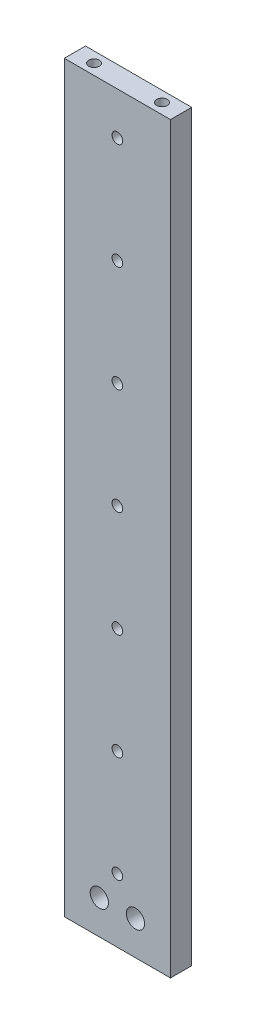
ISO-10303-21;
HEADER;
FILE_DESCRIPTION(('STEP AP214'),'2;1');
FILE_NAME('part.step','',(''),(''),'','','');
FILE_SCHEMA(('AUTOMOTIVE_DESIGN { 1 0 10303 214 1 1 1 1 }'));
ENDSEC;
DATA;
#1=APPLICATION_CONTEXT('core data for automotive mechanical design processes');
#2=APPLICATION_PROTOCOL_DEFINITION('international standard','automotive_design',2000,#1);
#3=PRODUCT_CONTEXT('',#1,'mechanical');
#4=PRODUCT('Part','Part','',(#3));
#5=PRODUCT_RELATED_PRODUCT_CATEGORY('part','',(#4));
#6=PRODUCT_DEFINITION_FORMATION('','',#4);
#7=PRODUCT_DEFINITION_CONTEXT('part definition',#1,'design');
#8=PRODUCT_DEFINITION('design','',#6,#7);
#9=PRODUCT_DEFINITION_SHAPE('','',#8);
#10=(LENGTH_UNIT() NAMED_UNIT(*) SI_UNIT(.MILLI.,.METRE.));
#11=(NAMED_UNIT(*) PLANE_ANGLE_UNIT() SI_UNIT($,.RADIAN.));
#12=(NAMED_UNIT(*) SI_UNIT($,.STERADIAN.) SOLID_ANGLE_UNIT());
#13=UNCERTAINTY_MEASURE_WITH_UNIT(LENGTH_MEASURE(1.E-05),#10,'distance_accuracy_value','');
#14=(GEOMETRIC_REPRESENTATION_CONTEXT(3) GLOBAL_UNCERTAINTY_ASSIGNED_CONTEXT((#13)) GLOBAL_UNIT_ASSIGNED_CONTEXT((#10,
#11,#12)) REPRESENTATION_CONTEXT('',''));
#15=CARTESIAN_POINT('',(0.,0.,0.));
#16=DIRECTION('',(0.,0.,1.));
#17=DIRECTION('',(1.,0.,0.));
#18=AXIS2_PLACEMENT_3D('',#15,#16,#17);
#19=CARTESIAN_POINT('',(-12.5,175.,0.));
#20=DIRECTION('',(0.,0.,1.));
#21=DIRECTION('',(0.,-1.,0.));
#22=AXIS2_PLACEMENT_3D('',#19,#20,#21);
#23=PLANE('',#22);
#24=CARTESIAN_POINT('',(4.25,8.,0.));
#25=DIRECTION('',(0.,0.,1.));
#26=DIRECTION('',(0.,-1.,0.));
#27=AXIS2_PLACEMENT_3D('',#24,#25,#26);
#28=CIRCLE('',#27,2.15);
#29=CARTESIAN_POINT('',(4.25,5.85,0.));
#30=VERTEX_POINT('',#29);
#31=EDGE_CURVE('E219',#30,#30,#28,.T.);
#32=ORIENTED_EDGE('',*,*,#31,.F.);
#33=EDGE_LOOP('',(#32));
#34=FACE_BOUND('',#33,.T.);
#35=CARTESIAN_POINT('',(-4.25,8.,0.));
#36=DIRECTION('',(0.,0.,1.));
#37=DIRECTION('',(0.,-1.,0.));
#38=AXIS2_PLACEMENT_3D('',#35,#36,#37);
#39=CIRCLE('',#38,2.15);
#40=CARTESIAN_POINT('',(-4.25,5.85,0.));
#41=VERTEX_POINT('',#40);
#42=EDGE_CURVE('E104',#41,#41,#39,.T.);
#43=ORIENTED_EDGE('',*,*,#42,.F.);
#44=EDGE_LOOP('',(#43));
#45=FACE_BOUND('',#44,.T.);
#46=CARTESIAN_POINT('',(0.,165.,0.));
#47=DIRECTION('',(0.,0.,-1.));
#48=DIRECTION('',(0.,1.,0.));
#49=AXIS2_PLACEMENT_3D('',#46,#47,#48);
#50=CIRCLE('',#49,1.25);
#51=CARTESIAN_POINT('',(0.,166.25,0.));
#52=VERTEX_POINT('',#51);
#53=EDGE_CURVE('E125',#52,#52,#50,.T.);
#54=ORIENTED_EDGE('',*,*,#53,.T.);
#55=EDGE_LOOP('',(#54));
#56=FACE_BOUND('',#55,.T.);
#57=CARTESIAN_POINT('',(0.,140.,0.));
#58=DIRECTION('',(0.,0.,-1.));
#59=DIRECTION('',(0.,1.,0.));
#60=AXIS2_PLACEMENT_3D('',#57,#58,#59);
#61=CIRCLE('',#60,1.25);
#62=CARTESIAN_POINT('',(0.,141.25,0.));
#63=VERTEX_POINT('',#62);
#64=EDGE_CURVE('E131',#63,#63,#61,.T.);
#65=ORIENTED_EDGE('',*,*,#64,.T.);
#66=EDGE_LOOP('',(#65));
#67=FACE_BOUND('',#66,.T.);
#68=CARTESIAN_POINT('',(0.,115.,0.));
#69=DIRECTION('',(0.,0.,-1.));
#70=DIRECTION('',(0.,1.,0.));
#71=AXIS2_PLACEMENT_3D('',#68,#69,#70);
#72=CIRCLE('',#71,1.25);
#73=CARTESIAN_POINT('',(0.,116.25,0.));
#74=VERTEX_POINT('',#73);
#75=EDGE_CURVE('E137',#74,#74,#72,.T.);
#76=ORIENTED_EDGE('',*,*,#75,.T.);
#77=EDGE_LOOP('',(#76));
#78=FACE_BOUND('',#77,.T.);
#79=CARTESIAN_POINT('',(0.,90.,0.));
#80=DIRECTION('',(0.,0.,-1.));
#81=DIRECTION('',(0.,1.,0.));
#82=AXIS2_PLACEMENT_3D('',#79,#80,#81);
#83=CIRCLE('',#82,1.25);
#84=CARTESIAN_POINT('',(0.,91.25,0.));
#85=VERTEX_POINT('',#84);
#86=EDGE_CURVE('E143',#85,#85,#83,.T.);
#87=ORIENTED_EDGE('',*,*,#86,.T.);
#88=EDGE_LOOP('',(#87));
#89=FACE_BOUND('',#88,.T.);
#90=CARTESIAN_POINT('',(0.,65.,0.));
#91=DIRECTION('',(0.,0.,-1.));
#92=DIRECTION('',(0.,1.,0.));
#93=AXIS2_PLACEMENT_3D('',#90,#91,#92);
#94=CIRCLE('',#93,1.25);
#95=CARTESIAN_POINT('',(0.,66.25,0.));
#96=VERTEX_POINT('',#95);
#97=EDGE_CURVE('E149',#96,#96,#94,.T.);
#98=ORIENTED_EDGE('',*,*,#97,.T.);
#99=EDGE_LOOP('',(#98));
#100=FACE_BOUND('',#99,.T.);
#101=CARTESIAN_POINT('',(0.,40.,0.));
#102=DIRECTION('',(0.,0.,-1.));
#103=DIRECTION('',(0.,1.,0.));
#104=AXIS2_PLACEMENT_3D('',#101,#102,#103);
#105=CIRCLE('',#104,1.25);
#106=CARTESIAN_POINT('',(0.,41.25,0.));
#107=VERTEX_POINT('',#106);
#108=EDGE_CURVE('E155',#107,#107,#105,.T.);
#109=ORIENTED_EDGE('',*,*,#108,.T.);
#110=EDGE_LOOP('',(#109));
#111=FACE_BOUND('',#110,.T.);
#112=CARTESIAN_POINT('',(0.,15.,0.));
#113=DIRECTION('',(0.,0.,-1.));
#114=DIRECTION('',(0.,1.,0.));
#115=AXIS2_PLACEMENT_3D('',#112,#113,#114);
#116=CIRCLE('',#115,1.25);
#117=CARTESIAN_POINT('',(0.,16.25,0.));
#118=VERTEX_POINT('',#117);
#119=EDGE_CURVE('E161',#118,#118,#116,.T.);
#120=ORIENTED_EDGE('',*,*,#119,.T.);
#121=EDGE_LOOP('',(#120));
#122=FACE_BOUND('',#121,.T.);
#123=DIRECTION('',(1.,0.,0.));
#124=VECTOR('',#123,1.);
#125=CARTESIAN_POINT('',(-12.5,0.,0.));
#126=LINE('',#125,#124);
#127=CARTESIAN_POINT('',(-12.5,0.,0.));
#128=VERTEX_POINT('',#127);
#129=CARTESIAN_POINT('',(12.5,0.,0.));
#130=VERTEX_POINT('',#129);
#131=EDGE_CURVE('E39',#128,#130,#126,.T.);
#132=ORIENTED_EDGE('',*,*,#131,.T.);
#133=DIRECTION('',(0.,-1.,0.));
#134=VECTOR('',#133,1.);
#135=CARTESIAN_POINT('',(12.5,175.,0.));
#136=LINE('',#135,#134);
#137=CARTESIAN_POINT('',(12.5,175.,0.));
#138=VERTEX_POINT('',#137);
#139=EDGE_CURVE('E164',#138,#130,#136,.T.);
#140=ORIENTED_EDGE('',*,*,#139,.F.);
#141=DIRECTION('',(1.,0.,0.));
#142=VECTOR('',#141,1.);
#143=CARTESIAN_POINT('',(-12.5,175.,0.));
#144=LINE('',#143,#142);
#145=CARTESIAN_POINT('',(-12.5,175.,0.));
#146=VERTEX_POINT('',#145);
#147=EDGE_CURVE('E11',#146,#138,#144,.T.);
#148=ORIENTED_EDGE('',*,*,#147,.F.);
#149=DIRECTION('',(0.,-1.,0.));
#150=VECTOR('',#149,1.);
#151=CARTESIAN_POINT('',(-12.5,175.,0.));
#152=LINE('',#151,#150);
#153=EDGE_CURVE('E176',#146,#128,#152,.T.);
#154=ORIENTED_EDGE('',*,*,#153,.T.);
#155=EDGE_LOOP('',(#132,#140,#148,#154));
#156=FACE_BOUND('',#155,.T.);
#157=ADVANCED_FACE('F36',(#34,#45,#56,#67,#78,#89,#100,#111,#122,#156),#23,.T.);
#158=CARTESIAN_POINT('',(-12.5,175.,-5.));
#159=DIRECTION('',(0.,1.,0.));
#160=DIRECTION('',(0.,0.,1.));
#161=AXIS2_PLACEMENT_3D('',#158,#159,#160);
#162=PLANE('',#161);
#163=CARTESIAN_POINT('',(-8.,175.,-2.5));
#164=DIRECTION('',(0.,1.,0.));
#165=DIRECTION('',(0.,0.,1.));
#166=AXIS2_PLACEMENT_3D('',#163,#164,#165);
#167=CIRCLE('',#166,1.25);
#168=CARTESIAN_POINT('',(-8.,175.,-1.25));
#169=VERTEX_POINT('',#168);
#170=EDGE_CURVE('E110',#169,#169,#167,.T.);
#171=ORIENTED_EDGE('',*,*,#170,.F.);
#172=EDGE_LOOP('',(#171));
#173=FACE_BOUND('',#172,.T.);
#174=CARTESIAN_POINT('',(8.,175.,-2.5));
#175=DIRECTION('',(0.,1.,0.));
#176=DIRECTION('',(0.,0.,1.));
#177=AXIS2_PLACEMENT_3D('',#174,#175,#176);
#178=CIRCLE('',#177,1.25);
#179=CARTESIAN_POINT('',(8.,175.,-1.25));
#180=VERTEX_POINT('',#179);
#181=EDGE_CURVE('E116',#180,#180,#178,.T.);
#182=ORIENTED_EDGE('',*,*,#181,.F.);
#183=EDGE_LOOP('',(#182));
#184=FACE_BOUND('',#183,.T.);
#185=ORIENTED_EDGE('',*,*,#147,.T.);
#186=DIRECTION('',(0.,0.,1.));
#187=VECTOR('',#186,1.);
#188=CARTESIAN_POINT('',(12.5,175.,-5.));
#189=LINE('',#188,#187);
#190=CARTESIAN_POINT('',(12.5,175.,-5.));
#191=VERTEX_POINT('',#190);
#192=EDGE_CURVE('E173',#191,#138,#189,.T.);
#193=ORIENTED_EDGE('',*,*,#192,.F.);
#194=DIRECTION('',(1.,0.,0.));
#195=VECTOR('',#194,1.);
#196=CARTESIAN_POINT('',(-12.5,175.,-5.));
#197=LINE('',#196,#195);
#198=CARTESIAN_POINT('',(-12.5,175.,-5.));
#199=VERTEX_POINT('',#198);
#200=EDGE_CURVE('E44',#199,#191,#197,.T.);
#201=ORIENTED_EDGE('',*,*,#200,.F.);
#202=DIRECTION('',(0.,0.,1.));
#203=VECTOR('',#202,1.);
#204=CARTESIAN_POINT('',(-12.5,175.,-5.));
#205=LINE('',#204,#203);
#206=EDGE_CURVE('E183',#199,#146,#205,.T.);
#207=ORIENTED_EDGE('',*,*,#206,.T.);
#208=EDGE_LOOP('',(#185,#193,#201,#207));
#209=FACE_BOUND('',#208,.T.);
#210=ADVANCED_FACE('F193',(#173,#184,#209),#162,.T.);
#211=CARTESIAN_POINT('',(-12.5,0.,-5.));
#212=DIRECTION('',(0.,0.,-1.));
#213=DIRECTION('',(-1.,0.,0.));
#214=AXIS2_PLACEMENT_3D('',#211,#212,#213);
#215=PLANE('',#214);
#216=CARTESIAN_POINT('',(4.25,8.,-5.));
#217=DIRECTION('',(0.,0.,-1.));
#218=DIRECTION('',(-1.,0.,0.));
#219=AXIS2_PLACEMENT_3D('',#216,#217,#218);
#220=CIRCLE('',#219,2.15);
#221=CARTESIAN_POINT('',(2.1,8.,-5.));
#222=VERTEX_POINT('',#221);
#223=EDGE_CURVE('E447',#222,#222,#220,.T.);
#224=ORIENTED_EDGE('',*,*,#223,.F.);
#225=EDGE_LOOP('',(#224));
#226=FACE_BOUND('',#225,.T.);
#227=CARTESIAN_POINT('',(-4.25,8.,-5.));
#228=DIRECTION('',(0.,0.,-1.));
#229=DIRECTION('',(-1.,0.,0.));
#230=AXIS2_PLACEMENT_3D('',#227,#228,#229);
#231=CIRCLE('',#230,2.15);
#232=CARTESIAN_POINT('',(-6.4,8.,-5.));
#233=VERTEX_POINT('',#232);
#234=EDGE_CURVE('E448',#233,#233,#231,.T.);
#235=ORIENTED_EDGE('',*,*,#234,.F.);
#236=EDGE_LOOP('',(#235));
#237=FACE_BOUND('',#236,.T.);
#238=CARTESIAN_POINT('',(0.,165.,-4.99999999999999));
#239=DIRECTION('',(0.,0.,-1.));
#240=DIRECTION('',(0.,1.,0.));
#241=AXIS2_PLACEMENT_3D('',#238,#239,#240);
#242=CIRCLE('',#241,1.25);
#243=CARTESIAN_POINT('',(0.,166.25,-4.99999999999999));
#244=VERTEX_POINT('',#243);
#245=EDGE_CURVE('E122',#244,#244,#242,.T.);
#246=ORIENTED_EDGE('',*,*,#245,.F.);
#247=EDGE_LOOP('',(#246));
#248=FACE_BOUND('',#247,.T.);
#249=CARTESIAN_POINT('',(0.,140.,-4.99999999999999));
#250=DIRECTION('',(0.,0.,-1.));
#251=DIRECTION('',(0.,1.,0.));
#252=AXIS2_PLACEMENT_3D('',#249,#250,#251);
#253=CIRCLE('',#252,1.25);
#254=CARTESIAN_POINT('',(0.,141.25,-4.99999999999999));
#255=VERTEX_POINT('',#254);
#256=EDGE_CURVE('E128',#255,#255,#253,.T.);
#257=ORIENTED_EDGE('',*,*,#256,.F.);
#258=EDGE_LOOP('',(#257));
#259=FACE_BOUND('',#258,.T.);
#260=CARTESIAN_POINT('',(0.,115.,-5.));
#261=DIRECTION('',(0.,0.,-1.));
#262=DIRECTION('',(0.,1.,0.));
#263=AXIS2_PLACEMENT_3D('',#260,#261,#262);
#264=CIRCLE('',#263,1.25);
#265=CARTESIAN_POINT('',(0.,116.25,-5.));
#266=VERTEX_POINT('',#265);
#267=EDGE_CURVE('E134',#266,#266,#264,.T.);
#268=ORIENTED_EDGE('',*,*,#267,.F.);
#269=EDGE_LOOP('',(#268));
#270=FACE_BOUND('',#269,.T.);
#271=CARTESIAN_POINT('',(0.,90.,-5.));
#272=DIRECTION('',(0.,0.,-1.));
#273=DIRECTION('',(0.,1.,0.));
#274=AXIS2_PLACEMENT_3D('',#271,#272,#273);
#275=CIRCLE('',#274,1.25);
#276=CARTESIAN_POINT('',(0.,91.25,-5.));
#277=VERTEX_POINT('',#276);
#278=EDGE_CURVE('E140',#277,#277,#275,.T.);
#279=ORIENTED_EDGE('',*,*,#278,.F.);
#280=EDGE_LOOP('',(#279));
#281=FACE_BOUND('',#280,.T.);
#282=CARTESIAN_POINT('',(0.,65.,-5.));
#283=DIRECTION('',(0.,0.,-1.));
#284=DIRECTION('',(0.,1.,0.));
#285=AXIS2_PLACEMENT_3D('',#282,#283,#284);
#286=CIRCLE('',#285,1.25);
#287=CARTESIAN_POINT('',(0.,66.25,-5.));
#288=VERTEX_POINT('',#287);
#289=EDGE_CURVE('E146',#288,#288,#286,.T.);
#290=ORIENTED_EDGE('',*,*,#289,.F.);
#291=EDGE_LOOP('',(#290));
#292=FACE_BOUND('',#291,.T.);
#293=CARTESIAN_POINT('',(0.,40.,-5.));
#294=DIRECTION('',(0.,0.,-1.));
#295=DIRECTION('',(0.,1.,0.));
#296=AXIS2_PLACEMENT_3D('',#293,#294,#295);
#297=CIRCLE('',#296,1.25);
#298=CARTESIAN_POINT('',(0.,41.25,-5.));
#299=VERTEX_POINT('',#298);
#300=EDGE_CURVE('E152',#299,#299,#297,.T.);
#301=ORIENTED_EDGE('',*,*,#300,.F.);
#302=EDGE_LOOP('',(#301));
#303=FACE_BOUND('',#302,.T.);
#304=CARTESIAN_POINT('',(0.,15.,-5.));
#305=DIRECTION('',(0.,0.,-1.));
#306=DIRECTION('',(0.,1.,0.));
#307=AXIS2_PLACEMENT_3D('',#304,#305,#306);
#308=CIRCLE('',#307,1.25);
#309=CARTESIAN_POINT('',(0.,16.25,-5.));
#310=VERTEX_POINT('',#309);
#311=EDGE_CURVE('E158',#310,#310,#308,.T.);
#312=ORIENTED_EDGE('',*,*,#311,.F.);
#313=EDGE_LOOP('',(#312));
#314=FACE_BOUND('',#313,.T.);
#315=ORIENTED_EDGE('',*,*,#200,.T.);
#316=DIRECTION('',(0.,1.,0.));
#317=VECTOR('',#316,1.);
#318=CARTESIAN_POINT('',(12.5,0.,-5.));
#319=LINE('',#318,#317);
#320=CARTESIAN_POINT('',(12.5,0.,-5.));
#321=VERTEX_POINT('',#320);
#322=EDGE_CURVE('E170',#321,#191,#319,.T.);
#323=ORIENTED_EDGE('',*,*,#322,.F.);
#324=DIRECTION('',(1.,0.,0.));
#325=VECTOR('',#324,1.);
#326=CARTESIAN_POINT('',(-12.5,0.,-5.));
#327=LINE('',#326,#325);
#328=CARTESIAN_POINT('',(-12.5,0.,-5.));
#329=VERTEX_POINT('',#328);
#330=EDGE_CURVE('E185',#329,#321,#327,.T.);
#331=ORIENTED_EDGE('',*,*,#330,.F.);
#332=DIRECTION('',(0.,1.,0.));
#333=VECTOR('',#332,1.);
#334=CARTESIAN_POINT('',(-12.5,0.,-5.));
#335=LINE('',#334,#333);
#336=EDGE_CURVE('E181',#329,#199,#335,.T.);
#337=ORIENTED_EDGE('',*,*,#336,.T.);
#338=EDGE_LOOP('',(#315,#323,#331,#337));
#339=FACE_BOUND('',#338,.T.);
#340=ADVANCED_FACE('F199',(#226,#237,#248,#259,#270,#281,#292,#303,#314,#339),#215,.T.);
#341=CARTESIAN_POINT('',(-12.5,0.,0.));
#342=DIRECTION('',(0.,-1.,0.));
#343=DIRECTION('',(0.,0.,-1.));
#344=AXIS2_PLACEMENT_3D('',#341,#342,#343);
#345=PLANE('',#344);
#346=CARTESIAN_POINT('',(-8.,0.,-2.5));
#347=DIRECTION('',(0.,-1.,0.));
#348=DIRECTION('',(0.,0.,-1.));
#349=AXIS2_PLACEMENT_3D('',#346,#347,#348);
#350=CIRCLE('',#349,1.25);
#351=CARTESIAN_POINT('',(-8.,0.,-3.75));
#352=VERTEX_POINT('',#351);
#353=EDGE_CURVE('E98',#352,#352,#350,.T.);
#354=ORIENTED_EDGE('',*,*,#353,.F.);
#355=EDGE_LOOP('',(#354));
#356=FACE_BOUND('',#355,.T.);
#357=CARTESIAN_POINT('',(8.,0.,-2.5));
#358=DIRECTION('',(0.,-1.,0.));
#359=DIRECTION('',(0.,0.,-1.));
#360=AXIS2_PLACEMENT_3D('',#357,#358,#359);
#361=CIRCLE('',#360,1.25);
#362=CARTESIAN_POINT('',(8.,0.,-3.75));
#363=VERTEX_POINT('',#362);
#364=EDGE_CURVE('E97',#363,#363,#361,.T.);
#365=ORIENTED_EDGE('',*,*,#364,.F.);
#366=EDGE_LOOP('',(#365));
#367=FACE_BOUND('',#366,.T.);
#368=ORIENTED_EDGE('',*,*,#330,.T.);
#369=DIRECTION('',(0.,0.,-1.));
#370=VECTOR('',#369,1.);
#371=CARTESIAN_POINT('',(12.5,0.,0.));
#372=LINE('',#371,#370);
#373=EDGE_CURVE('E167',#130,#321,#372,.T.);
#374=ORIENTED_EDGE('',*,*,#373,.F.);
#375=ORIENTED_EDGE('',*,*,#131,.F.);
#376=DIRECTION('',(0.,0.,-1.));
#377=VECTOR('',#376,1.);
#378=CARTESIAN_POINT('',(-12.5,0.,0.));
#379=LINE('',#378,#377);
#380=EDGE_CURVE('E178',#128,#329,#379,.T.);
#381=ORIENTED_EDGE('',*,*,#380,.T.);
#382=EDGE_LOOP('',(#368,#374,#375,#381));
#383=FACE_BOUND('',#382,.T.);
#384=ADVANCED_FACE('F189',(#356,#367,#383),#345,.T.);
#385=CARTESIAN_POINT('',(-12.5,0.,0.));
#386=DIRECTION('',(1.,0.,0.));
#387=DIRECTION('',(0.,0.,-1.));
#388=AXIS2_PLACEMENT_3D('',#385,#386,#387);
#389=PLANE('',#388);
#390=ORIENTED_EDGE('',*,*,#153,.F.);
#391=ORIENTED_EDGE('',*,*,#206,.F.);
#392=ORIENTED_EDGE('',*,*,#336,.F.);
#393=ORIENTED_EDGE('',*,*,#380,.F.);
#394=EDGE_LOOP('',(#390,#391,#392,#393));
#395=FACE_BOUND('',#394,.T.);
#396=ADVANCED_FACE('F197',(#395),#389,.F.);
#397=CARTESIAN_POINT('',(12.5,0.,0.));
#398=DIRECTION('',(1.,0.,0.));
#399=DIRECTION('',(0.,0.,-1.));
#400=AXIS2_PLACEMENT_3D('',#397,#398,#399);
#401=PLANE('',#400);
#402=ORIENTED_EDGE('',*,*,#139,.T.);
#403=ORIENTED_EDGE('',*,*,#373,.T.);
#404=ORIENTED_EDGE('',*,*,#322,.T.);
#405=ORIENTED_EDGE('',*,*,#192,.T.);
#406=EDGE_LOOP('',(#402,#403,#404,#405));
#407=FACE_BOUND('',#406,.T.);
#408=ADVANCED_FACE('F192',(#407),#401,.T.);
#409=CARTESIAN_POINT('',(0.,15.,-5.));
#410=DIRECTION('',(0.,0.,-1.));
#411=DIRECTION('',(0.,1.,0.));
#412=AXIS2_PLACEMENT_3D('',#409,#410,#411);
#413=CYLINDRICAL_SURFACE('',#412,1.25);
#414=ORIENTED_EDGE('',*,*,#119,.F.);
#415=EDGE_LOOP('',(#414));
#416=FACE_BOUND('',#415,.T.);
#417=ORIENTED_EDGE('',*,*,#311,.T.);
#418=EDGE_LOOP('',(#417));
#419=FACE_BOUND('',#418,.T.);
#420=ADVANCED_FACE('F237',(#416,#419),#413,.F.);
#421=CARTESIAN_POINT('',(0.,40.,-5.));
#422=DIRECTION('',(0.,0.,-1.));
#423=DIRECTION('',(0.,1.,0.));
#424=AXIS2_PLACEMENT_3D('',#421,#422,#423);
#425=CYLINDRICAL_SURFACE('',#424,1.25);
#426=ORIENTED_EDGE('',*,*,#108,.F.);
#427=EDGE_LOOP('',(#426));
#428=FACE_BOUND('',#427,.T.);
#429=ORIENTED_EDGE('',*,*,#300,.T.);
#430=EDGE_LOOP('',(#429));
#431=FACE_BOUND('',#430,.T.);
#432=ADVANCED_FACE('F240',(#428,#431),#425,.F.);
#433=CARTESIAN_POINT('',(0.,65.,-5.));
#434=DIRECTION('',(0.,0.,-1.));
#435=DIRECTION('',(0.,1.,0.));
#436=AXIS2_PLACEMENT_3D('',#433,#434,#435);
#437=CYLINDRICAL_SURFACE('',#436,1.25);
#438=ORIENTED_EDGE('',*,*,#97,.F.);
#439=EDGE_LOOP('',(#438));
#440=FACE_BOUND('',#439,.T.);
#441=ORIENTED_EDGE('',*,*,#289,.T.);
#442=EDGE_LOOP('',(#441));
#443=FACE_BOUND('',#442,.T.);
#444=ADVANCED_FACE('F248',(#440,#443),#437,.F.);
#445=CARTESIAN_POINT('',(0.,90.,-5.));
#446=DIRECTION('',(0.,0.,-1.));
#447=DIRECTION('',(0.,1.,0.));
#448=AXIS2_PLACEMENT_3D('',#445,#446,#447);
#449=CYLINDRICAL_SURFACE('',#448,1.25);
#450=ORIENTED_EDGE('',*,*,#86,.F.);
#451=EDGE_LOOP('',(#450));
#452=FACE_BOUND('',#451,.T.);
#453=ORIENTED_EDGE('',*,*,#278,.T.);
#454=EDGE_LOOP('',(#453));
#455=FACE_BOUND('',#454,.T.);
#456=ADVANCED_FACE('F282',(#452,#455),#449,.F.);
#457=CARTESIAN_POINT('',(0.,115.,-5.));
#458=DIRECTION('',(0.,0.,-1.));
#459=DIRECTION('',(0.,1.,0.));
#460=AXIS2_PLACEMENT_3D('',#457,#458,#459);
#461=CYLINDRICAL_SURFACE('',#460,1.25);
#462=ORIENTED_EDGE('',*,*,#75,.F.);
#463=EDGE_LOOP('',(#462));
#464=FACE_BOUND('',#463,.T.);
#465=ORIENTED_EDGE('',*,*,#267,.T.);
#466=EDGE_LOOP('',(#465));
#467=FACE_BOUND('',#466,.T.);
#468=ADVANCED_FACE('F291',(#464,#467),#461,.F.);
#469=CARTESIAN_POINT('',(0.,140.,-4.99999999999999));
#470=DIRECTION('',(0.,0.,-1.));
#471=DIRECTION('',(0.,1.,0.));
#472=AXIS2_PLACEMENT_3D('',#469,#470,#471);
#473=CYLINDRICAL_SURFACE('',#472,1.25);
#474=ORIENTED_EDGE('',*,*,#64,.F.);
#475=EDGE_LOOP('',(#474));
#476=FACE_BOUND('',#475,.T.);
#477=ORIENTED_EDGE('',*,*,#256,.T.);
#478=EDGE_LOOP('',(#477));
#479=FACE_BOUND('',#478,.T.);
#480=ADVANCED_FACE('F301',(#476,#479),#473,.F.);
#481=CARTESIAN_POINT('',(0.,165.,-4.99999999999999));
#482=DIRECTION('',(0.,0.,-1.));
#483=DIRECTION('',(0.,1.,0.));
#484=AXIS2_PLACEMENT_3D('',#481,#482,#483);
#485=CYLINDRICAL_SURFACE('',#484,1.25);
#486=ORIENTED_EDGE('',*,*,#53,.F.);
#487=EDGE_LOOP('',(#486));
#488=FACE_BOUND('',#487,.T.);
#489=ORIENTED_EDGE('',*,*,#245,.T.);
#490=EDGE_LOOP('',(#489));
#491=FACE_BOUND('',#490,.T.);
#492=ADVANCED_FACE('F311',(#488,#491),#485,.F.);
#493=CARTESIAN_POINT('',(8.,166.5,-2.5));
#494=DIRECTION('',(0.,1.,0.));
#495=DIRECTION('',(0.,0.,1.));
#496=AXIS2_PLACEMENT_3D('',#493,#494,#495);
#497=CONICAL_SURFACE('',#496,1.25,1.02974425867666);
#498=CARTESIAN_POINT('',(8.,165.748924226216,-2.5));
#499=VERTEX_POINT('',#498);
#500=VERTEX_LOOP('',#499);
#501=FACE_BOUND('',#500,.T.);
#502=CARTESIAN_POINT('',(8.,166.5,-2.5));
#503=DIRECTION('',(0.,1.,0.));
#504=DIRECTION('',(0.,0.,1.));
#505=AXIS2_PLACEMENT_3D('',#502,#503,#504);
#506=CIRCLE('',#505,1.25);
#507=CARTESIAN_POINT('',(8.,166.5,-1.25));
#508=VERTEX_POINT('',#507);
#509=EDGE_CURVE('E119',#508,#508,#506,.T.);
#510=ORIENTED_EDGE('',*,*,#509,.T.);
#511=EDGE_LOOP('',(#510));
#512=FACE_BOUND('',#511,.T.);
#513=ADVANCED_FACE('F321',(#501,#512),#497,.F.);
#514=CARTESIAN_POINT('',(8.,175.,-2.5));
#515=DIRECTION('',(0.,1.,0.));
#516=DIRECTION('',(0.,0.,1.));
#517=AXIS2_PLACEMENT_3D('',#514,#515,#516);
#518=CYLINDRICAL_SURFACE('',#517,1.25);
#519=ORIENTED_EDGE('',*,*,#509,.F.);
#520=EDGE_LOOP('',(#519));
#521=FACE_BOUND('',#520,.T.);
#522=ORIENTED_EDGE('',*,*,#181,.T.);
#523=EDGE_LOOP('',(#522));
#524=FACE_BOUND('',#523,.T.);
#525=ADVANCED_FACE('F339',(#521,#524),#518,.F.);
#526=CARTESIAN_POINT('',(-8.,166.5,-2.5));
#527=DIRECTION('',(0.,1.,0.));
#528=DIRECTION('',(0.,0.,1.));
#529=AXIS2_PLACEMENT_3D('',#526,#527,#528);
#530=CONICAL_SURFACE('',#529,1.25,1.02974425867666);
#531=CARTESIAN_POINT('',(-8.,165.748924226216,-2.5));
#532=VERTEX_POINT('',#531);
#533=VERTEX_LOOP('',#532);
#534=FACE_BOUND('',#533,.T.);
#535=CARTESIAN_POINT('',(-8.,166.5,-2.5));
#536=DIRECTION('',(0.,1.,0.));
#537=DIRECTION('',(0.,0.,1.));
#538=AXIS2_PLACEMENT_3D('',#535,#536,#537);
#539=CIRCLE('',#538,1.25);
#540=CARTESIAN_POINT('',(-8.,166.5,-1.25));
#541=VERTEX_POINT('',#540);
#542=EDGE_CURVE('E113',#541,#541,#539,.T.);
#543=ORIENTED_EDGE('',*,*,#542,.T.);
#544=EDGE_LOOP('',(#543));
#545=FACE_BOUND('',#544,.T.);
#546=ADVANCED_FACE('F350',(#534,#545),#530,.F.);
#547=CARTESIAN_POINT('',(-8.,175.,-2.5));
#548=DIRECTION('',(0.,1.,0.));
#549=DIRECTION('',(0.,0.,1.));
#550=AXIS2_PLACEMENT_3D('',#547,#548,#549);
#551=CYLINDRICAL_SURFACE('',#550,1.25);
#552=ORIENTED_EDGE('',*,*,#542,.F.);
#553=EDGE_LOOP('',(#552));
#554=FACE_BOUND('',#553,.T.);
#555=ORIENTED_EDGE('',*,*,#170,.T.);
#556=EDGE_LOOP('',(#555));
#557=FACE_BOUND('',#556,.T.);
#558=ADVANCED_FACE('F363',(#554,#557),#551,.F.);
#559=CARTESIAN_POINT('',(8.,8.5,-2.5));
#560=DIRECTION('',(0.,-1.,0.));
#561=DIRECTION('',(0.,0.,-1.));
#562=AXIS2_PLACEMENT_3D('',#559,#560,#561);
#563=CONICAL_SURFACE('',#562,1.25,1.02974425867665);
#564=CARTESIAN_POINT('',(8.,9.25107577378445,-2.5));
#565=VERTEX_POINT('',#564);
#566=VERTEX_LOOP('',#565);
#567=FACE_BOUND('',#566,.T.);
#568=CARTESIAN_POINT('',(8.,8.5,-2.5));
#569=DIRECTION('',(0.,-1.,0.));
#570=DIRECTION('',(0.,0.,-1.));
#571=AXIS2_PLACEMENT_3D('',#568,#569,#570);
#572=CIRCLE('',#571,1.25);
#573=CARTESIAN_POINT('',(8.,8.5,-3.75));
#574=VERTEX_POINT('',#573);
#575=EDGE_CURVE('E101',#574,#574,#572,.T.);
#576=ORIENTED_EDGE('',*,*,#575,.T.);
#577=EDGE_LOOP('',(#576));
#578=FACE_BOUND('',#577,.T.);
#579=ADVANCED_FACE('F372',(#567,#578),#563,.F.);
#580=CARTESIAN_POINT('',(8.,0.,-2.5));
#581=DIRECTION('',(0.,-1.,0.));
#582=DIRECTION('',(0.,0.,-1.));
#583=AXIS2_PLACEMENT_3D('',#580,#581,#582);
#584=CYLINDRICAL_SURFACE('',#583,1.25);
#585=ORIENTED_EDGE('',*,*,#575,.F.);
#586=EDGE_LOOP('',(#585));
#587=FACE_BOUND('',#586,.T.);
#588=ORIENTED_EDGE('',*,*,#364,.T.);
#589=EDGE_LOOP('',(#588));
#590=FACE_BOUND('',#589,.T.);
#591=ADVANCED_FACE('F91',(#587,#590),#584,.F.);
#592=CARTESIAN_POINT('',(-8.,8.5,-2.5));
#593=DIRECTION('',(0.,-1.,0.));
#594=DIRECTION('',(0.,0.,-1.));
#595=AXIS2_PLACEMENT_3D('',#592,#593,#594);
#596=CONICAL_SURFACE('',#595,1.25,1.02974425867665);
#597=CARTESIAN_POINT('',(-8.,9.25107577378445,-2.5));
#598=VERTEX_POINT('',#597);
#599=VERTEX_LOOP('',#598);
#600=FACE_BOUND('',#599,.T.);
#601=CARTESIAN_POINT('',(-8.,8.5,-2.5));
#602=DIRECTION('',(0.,-1.,0.));
#603=DIRECTION('',(0.,0.,-1.));
#604=AXIS2_PLACEMENT_3D('',#601,#602,#603);
#605=CIRCLE('',#604,1.25);
#606=CARTESIAN_POINT('',(-8.,8.5,-3.75));
#607=VERTEX_POINT('',#606);
#608=EDGE_CURVE('E95',#607,#607,#605,.T.);
#609=ORIENTED_EDGE('',*,*,#608,.T.);
#610=EDGE_LOOP('',(#609));
#611=FACE_BOUND('',#610,.T.);
#612=ADVANCED_FACE('F87',(#600,#611),#596,.F.);
#613=CARTESIAN_POINT('',(-8.,0.,-2.5));
#614=DIRECTION('',(0.,-1.,0.));
#615=DIRECTION('',(0.,0.,-1.));
#616=AXIS2_PLACEMENT_3D('',#613,#614,#615);
#617=CYLINDRICAL_SURFACE('',#616,1.25);
#618=ORIENTED_EDGE('',*,*,#608,.F.);
#619=EDGE_LOOP('',(#618));
#620=FACE_BOUND('',#619,.T.);
#621=ORIENTED_EDGE('',*,*,#353,.T.);
#622=EDGE_LOOP('',(#621));
#623=FACE_BOUND('',#622,.T.);
#624=ADVANCED_FACE('F90',(#620,#623),#617,.F.);
#625=CARTESIAN_POINT('',(-4.25,8.,-5.));
#626=DIRECTION('',(0.,0.,-1.));
#627=DIRECTION('',(-1.,0.,0.));
#628=AXIS2_PLACEMENT_3D('',#625,#626,#627);
#629=CYLINDRICAL_SURFACE('',#628,2.15);
#630=ORIENTED_EDGE('',*,*,#234,.T.);
#631=EDGE_LOOP('',(#630));
#632=FACE_BOUND('',#631,.T.);
#633=ORIENTED_EDGE('',*,*,#42,.T.);
#634=EDGE_LOOP('',(#633));
#635=FACE_BOUND('',#634,.T.);
#636=ADVANCED_FACE('F414',(#632,#635),#629,.F.);
#637=CARTESIAN_POINT('',(4.25,8.,-5.));
#638=DIRECTION('',(0.,0.,-1.));
#639=DIRECTION('',(-1.,0.,0.));
#640=AXIS2_PLACEMENT_3D('',#637,#638,#639);
#641=CYLINDRICAL_SURFACE('',#640,2.15);
#642=ORIENTED_EDGE('',*,*,#223,.T.);
#643=EDGE_LOOP('',(#642));
#644=FACE_BOUND('',#643,.T.);
#645=ORIENTED_EDGE('',*,*,#31,.T.);
#646=EDGE_LOOP('',(#645));
#647=FACE_BOUND('',#646,.T.);
#648=ADVANCED_FACE('F431',(#644,#647),#641,.F.);
#649=CLOSED_SHELL('',(#157,#210,#340,#384,#396,#408,#420,#432,#444,#456,#468,#480,#492,#513,
#525,#546,#558,#579,#591,#612,#624,#636,#648));
#650=MANIFOLD_SOLID_BREP('B2',#649);
#651=ADVANCED_BREP_SHAPE_REPRESENTATION('',(#18,#650),#14);
#652=SHAPE_DEFINITION_REPRESENTATION(#9,#651);
ENDSEC;
END-ISO-10303-21;
